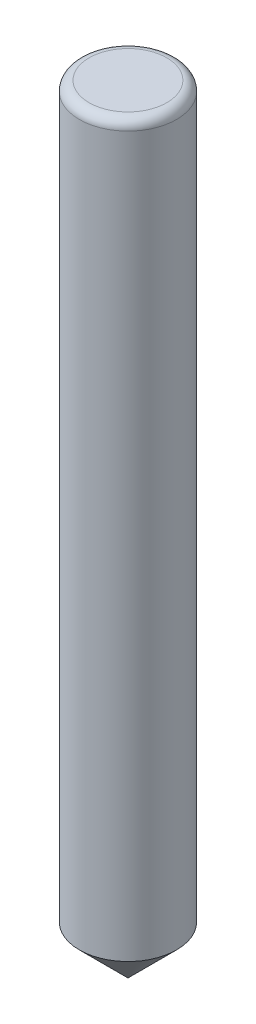
ISO-10303-21;
HEADER;
FILE_DESCRIPTION(('STEP AP214'),'2;1');
FILE_NAME('part.step','',(''),(''),'','','');
FILE_SCHEMA(('AUTOMOTIVE_DESIGN { 1 0 10303 214 1 1 1 1 }'));
ENDSEC;
DATA;
#1=APPLICATION_CONTEXT('core data for automotive mechanical design processes');
#2=APPLICATION_PROTOCOL_DEFINITION('international standard','automotive_design',2000,#1);
#3=PRODUCT_CONTEXT('',#1,'mechanical');
#4=PRODUCT('Part','Part','',(#3));
#5=PRODUCT_RELATED_PRODUCT_CATEGORY('part','',(#4));
#6=PRODUCT_DEFINITION_FORMATION('','',#4);
#7=PRODUCT_DEFINITION_CONTEXT('part definition',#1,'design');
#8=PRODUCT_DEFINITION('design','',#6,#7);
#9=PRODUCT_DEFINITION_SHAPE('','',#8);
#10=(LENGTH_UNIT() NAMED_UNIT(*) SI_UNIT(.MILLI.,.METRE.));
#11=(NAMED_UNIT(*) PLANE_ANGLE_UNIT() SI_UNIT($,.RADIAN.));
#12=(NAMED_UNIT(*) SI_UNIT($,.STERADIAN.) SOLID_ANGLE_UNIT());
#13=UNCERTAINTY_MEASURE_WITH_UNIT(LENGTH_MEASURE(1.E-05),#10,'distance_accuracy_value','');
#14=(GEOMETRIC_REPRESENTATION_CONTEXT(3) GLOBAL_UNCERTAINTY_ASSIGNED_CONTEXT((#13)) GLOBAL_UNIT_ASSIGNED_CONTEXT((#10,
#11,#12)) REPRESENTATION_CONTEXT('',''));
#15=CARTESIAN_POINT('',(0.,0.,0.));
#16=DIRECTION('',(0.,0.,1.));
#17=DIRECTION('',(1.,0.,0.));
#18=AXIS2_PLACEMENT_3D('',#15,#16,#17);
#19=CARTESIAN_POINT('',(0.,80.,0.));
#20=DIRECTION('',(0.,-1.,0.));
#21=DIRECTION('',(0.,0.,-1.));
#22=AXIS2_PLACEMENT_3D('',#19,#20,#21);
#23=CYLINDRICAL_SURFACE('',#22,5.);
#24=CARTESIAN_POINT('',(0.,79.,0.));
#25=DIRECTION('',(0.,1.,0.));
#26=DIRECTION('',(0.,0.,1.));
#27=AXIS2_PLACEMENT_3D('',#24,#25,#26);
#28=CIRCLE('',#27,5.);
#29=CARTESIAN_POINT('',(0.,79.,5.));
#30=VERTEX_POINT('',#29);
#31=EDGE_CURVE('E11',#30,#30,#28,.F.);
#32=ORIENTED_EDGE('',*,*,#31,.T.);
#33=EDGE_LOOP('',(#32));
#34=FACE_BOUND('',#33,.T.);
#35=CARTESIAN_POINT('',(0.,4.99999999999999,0.));
#36=DIRECTION('',(0.,1.,0.));
#37=DIRECTION('',(0.,0.,1.));
#38=AXIS2_PLACEMENT_3D('',#35,#36,#37);
#39=CIRCLE('',#38,5.);
#40=CARTESIAN_POINT('',(0.,4.99999999999999,5.));
#41=VERTEX_POINT('',#40);
#42=EDGE_CURVE('E53',#41,#41,#39,.T.);
#43=ORIENTED_EDGE('',*,*,#42,.T.);
#44=EDGE_LOOP('',(#43));
#45=FACE_BOUND('',#44,.T.);
#46=ADVANCED_FACE('F37',(#34,#45),#23,.T.);
#47=CARTESIAN_POINT('',(0.,80.,0.));
#48=DIRECTION('',(0.,1.,0.));
#49=DIRECTION('',(0.,0.,1.));
#50=AXIS2_PLACEMENT_3D('',#47,#48,#49);
#51=PLANE('',#50);
#52=CARTESIAN_POINT('',(0.,80.,0.));
#53=DIRECTION('',(0.,1.,0.));
#54=DIRECTION('',(0.,0.,1.));
#55=AXIS2_PLACEMENT_3D('',#52,#53,#54);
#56=CIRCLE('',#55,4.);
#57=CARTESIAN_POINT('',(0.,80.,4.));
#58=VERTEX_POINT('',#57);
#59=EDGE_CURVE('E44',#58,#58,#56,.T.);
#60=ORIENTED_EDGE('',*,*,#59,.T.);
#61=EDGE_LOOP('',(#60));
#62=FACE_BOUND('',#61,.T.);
#63=ADVANCED_FACE('F50',(#62),#51,.T.);
#64=CARTESIAN_POINT('',(0.,4.99999999999999,0.));
#65=DIRECTION('',(0.,1.,0.));
#66=DIRECTION('',(0.,0.,1.));
#67=AXIS2_PLACEMENT_3D('',#64,#65,#66);
#68=CONICAL_SURFACE('',#67,5.00000000000001,0.785398163397451);
#69=CARTESIAN_POINT('',(0.,0.,0.));
#70=VERTEX_POINT('',#69);
#71=VERTEX_LOOP('',#70);
#72=FACE_BOUND('',#71,.T.);
#73=ORIENTED_EDGE('',*,*,#42,.F.);
#74=EDGE_LOOP('',(#73));
#75=FACE_BOUND('',#74,.T.);
#76=ADVANCED_FACE('F47',(#72,#75),#68,.T.);
#77=CARTESIAN_POINT('',(0.,79.,0.));
#78=DIRECTION('',(0.,1.,0.));
#79=DIRECTION('',(0.,0.,1.));
#80=AXIS2_PLACEMENT_3D('',#77,#78,#79);
#81=TOROIDAL_SURFACE('',#80,4.,1.);
#82=ORIENTED_EDGE('',*,*,#31,.F.);
#83=EDGE_LOOP('',(#82));
#84=FACE_BOUND('',#83,.T.);
#85=ORIENTED_EDGE('',*,*,#59,.F.);
#86=EDGE_LOOP('',(#85));
#87=FACE_BOUND('',#86,.T.);
#88=ADVANCED_FACE('F39',(#84,#87),#81,.T.);
#89=CLOSED_SHELL('',(#46,#63,#76,#88));
#90=MANIFOLD_SOLID_BREP('B2',#89);
#91=ADVANCED_BREP_SHAPE_REPRESENTATION('',(#18,#90),#14);
#92=SHAPE_DEFINITION_REPRESENTATION(#9,#91);
ENDSEC;
END-ISO-10303-21;
